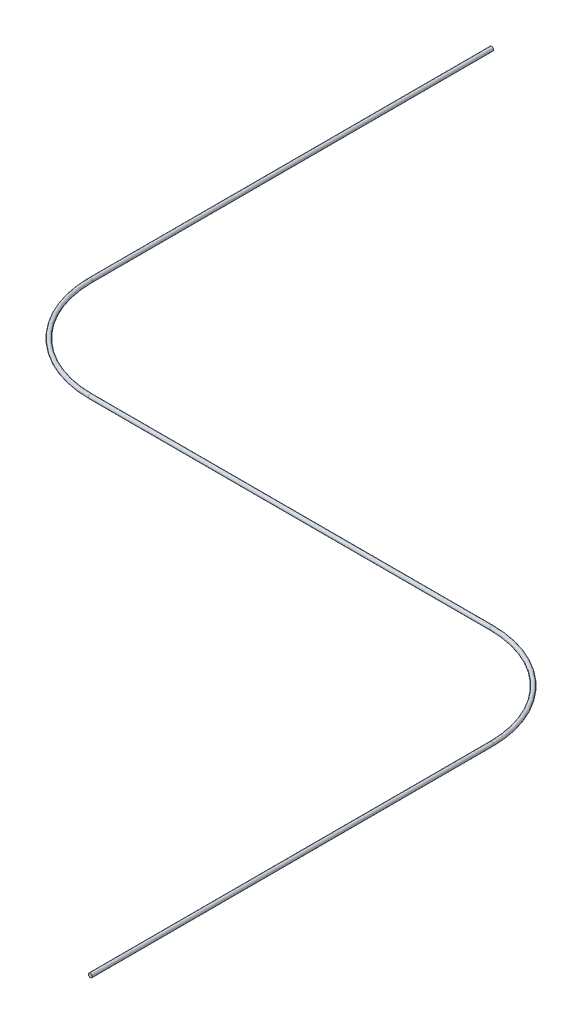
ISO-10303-21;
HEADER;
FILE_DESCRIPTION(('STEP AP214'),'2;1');
FILE_NAME('part.step','',(''),(''),'','','');
FILE_SCHEMA(('AUTOMOTIVE_DESIGN { 1 0 10303 214 1 1 1 1 }'));
ENDSEC;
DATA;
#1=APPLICATION_CONTEXT('core data for automotive mechanical design processes');
#2=APPLICATION_PROTOCOL_DEFINITION('international standard','automotive_design',2000,#1);
#3=PRODUCT_CONTEXT('',#1,'mechanical');
#4=PRODUCT('Part','Part','',(#3));
#5=PRODUCT_RELATED_PRODUCT_CATEGORY('part','',(#4));
#6=PRODUCT_DEFINITION_FORMATION('','',#4);
#7=PRODUCT_DEFINITION_CONTEXT('part definition',#1,'design');
#8=PRODUCT_DEFINITION('design','',#6,#7);
#9=PRODUCT_DEFINITION_SHAPE('','',#8);
#10=(LENGTH_UNIT() NAMED_UNIT(*) SI_UNIT(.MILLI.,.METRE.));
#11=(NAMED_UNIT(*) PLANE_ANGLE_UNIT() SI_UNIT($,.RADIAN.));
#12=(NAMED_UNIT(*) SI_UNIT($,.STERADIAN.) SOLID_ANGLE_UNIT());
#13=UNCERTAINTY_MEASURE_WITH_UNIT(LENGTH_MEASURE(1.E-05),#10,'distance_accuracy_value','');
#14=(GEOMETRIC_REPRESENTATION_CONTEXT(3) GLOBAL_UNCERTAINTY_ASSIGNED_CONTEXT((#13)) GLOBAL_UNIT_ASSIGNED_CONTEXT((#10,
#11,#12)) REPRESENTATION_CONTEXT('',''));
#15=CARTESIAN_POINT('',(0.,0.,0.));
#16=DIRECTION('',(0.,0.,1.));
#17=DIRECTION('',(1.,0.,0.));
#18=AXIS2_PLACEMENT_3D('',#15,#16,#17);
#19=CARTESIAN_POINT('',(0.,0.,0.));
#20=DIRECTION('',(0.,0.,1.));
#21=DIRECTION('',(1.,0.,0.));
#22=AXIS2_PLACEMENT_3D('',#19,#20,#21);
#23=PLANE('',#22);
#24=CARTESIAN_POINT('',(0.,0.,0.));
#25=DIRECTION('',(0.,0.,1.));
#26=DIRECTION('',(1.,0.,0.));
#27=AXIS2_PLACEMENT_3D('',#24,#25,#26);
#28=CIRCLE('',#27,2.);
#29=CARTESIAN_POINT('',(2.,0.,0.));
#30=VERTEX_POINT('',#29);
#31=EDGE_CURVE('E69',#30,#30,#28,.T.);
#32=ORIENTED_EDGE('',*,*,#31,.T.);
#33=EDGE_LOOP('',(#32));
#34=FACE_BOUND('',#33,.T.);
#35=ADVANCED_FACE('F41',(#34),#23,.T.);
#36=CARTESIAN_POINT('',(-600.,0.,-1000.));
#37=DIRECTION('',(0.,0.,1.));
#38=DIRECTION('',(1.,0.,0.));
#39=AXIS2_PLACEMENT_3D('',#36,#37,#38);
#40=PLANE('',#39);
#41=CARTESIAN_POINT('',(-600.,0.,-1000.));
#42=DIRECTION('',(0.,0.,1.));
#43=DIRECTION('',(1.,0.,0.));
#44=AXIS2_PLACEMENT_3D('',#41,#42,#43);
#45=CIRCLE('',#44,2.);
#46=CARTESIAN_POINT('',(-598.,0.,-1000.));
#47=VERTEX_POINT('',#46);
#48=EDGE_CURVE('E10',#47,#47,#45,.T.);
#49=ORIENTED_EDGE('',*,*,#48,.F.);
#50=EDGE_LOOP('',(#49));
#51=FACE_BOUND('',#50,.T.);
#52=ADVANCED_FACE('F77',(#51),#40,.F.);
#53=CARTESIAN_POINT('',(0.,0.,0.));
#54=DIRECTION('',(0.,0.,-1.));
#55=DIRECTION('',(-1.,0.,0.));
#56=AXIS2_PLACEMENT_3D('',#53,#54,#55);
#57=CYLINDRICAL_SURFACE('',#56,2.);
#58=CARTESIAN_POINT('',(0.,0.,-399.999999999999));
#59=DIRECTION('',(0.,0.,1.));
#60=DIRECTION('',(1.,0.,0.));
#61=AXIS2_PLACEMENT_3D('',#58,#59,#60);
#62=CIRCLE('',#61,2.);
#63=CARTESIAN_POINT('',(1.99999999999997,0.,-399.999999999999));
#64=VERTEX_POINT('',#63);
#65=EDGE_CURVE('E65',#64,#64,#62,.T.);
#66=ORIENTED_EDGE('',*,*,#65,.T.);
#67=EDGE_LOOP('',(#66));
#68=FACE_BOUND('',#67,.T.);
#69=ORIENTED_EDGE('',*,*,#31,.F.);
#70=EDGE_LOOP('',(#69));
#71=FACE_BOUND('',#70,.T.);
#72=ADVANCED_FACE('F74',(#68,#71),#57,.T.);
#73=CARTESIAN_POINT('',(-100.,0.,-400.));
#74=DIRECTION('',(0.,1.,0.));
#75=DIRECTION('',(0.,0.,1.));
#76=AXIS2_PLACEMENT_3D('',#73,#74,#75);
#77=TOROIDAL_SURFACE('',#76,100.,2.);
#78=CARTESIAN_POINT('',(-100.000000000001,0.,-500.));
#79=DIRECTION('',(1.,0.,0.));
#80=DIRECTION('',(0.,0.,-1.));
#81=AXIS2_PLACEMENT_3D('',#78,#79,#80);
#82=CIRCLE('',#81,2.);
#83=CARTESIAN_POINT('',(-100.000000000001,0.,-502.));
#84=VERTEX_POINT('',#83);
#85=EDGE_CURVE('E60',#84,#84,#82,.T.);
#86=CARTESIAN_POINT('',(-100.,0.,-400.));
#87=DIRECTION('',(0.,1.,0.));
#88=DIRECTION('',(0.,0.,1.));
#89=AXIS2_PLACEMENT_3D('',#86,#87,#88);
#90=CIRCLE('',#89,102.);
#91=EDGE_CURVE('',#64,#84,#90,.T.);
#92=ORIENTED_EDGE('',*,*,#65,.F.);
#93=ORIENTED_EDGE('',*,*,#85,.T.);
#94=ORIENTED_EDGE('',*,*,#91,.T.);
#95=ORIENTED_EDGE('',*,*,#91,.F.);
#96=EDGE_LOOP('',(#92,#94,#93,#95));
#97=FACE_BOUND('',#96,.T.);
#98=ADVANCED_FACE('F76',(#97),#77,.T.);
#99=CARTESIAN_POINT('',(-100.000000000001,0.,-500.));
#100=DIRECTION('',(-1.,0.,0.));
#101=DIRECTION('',(0.,0.,1.));
#102=AXIS2_PLACEMENT_3D('',#99,#100,#101);
#103=CYLINDRICAL_SURFACE('',#102,2.);
#104=CARTESIAN_POINT('',(-500.,0.,-500.));
#105=DIRECTION('',(1.,0.,0.));
#106=DIRECTION('',(0.,0.,-1.));
#107=AXIS2_PLACEMENT_3D('',#104,#105,#106);
#108=CIRCLE('',#107,2.);
#109=CARTESIAN_POINT('',(-500.,0.,-498.));
#110=VERTEX_POINT('',#109);
#111=EDGE_CURVE('E54',#110,#110,#108,.T.);
#112=ORIENTED_EDGE('',*,*,#111,.T.);
#113=EDGE_LOOP('',(#112));
#114=FACE_BOUND('',#113,.T.);
#115=ORIENTED_EDGE('',*,*,#85,.F.);
#116=EDGE_LOOP('',(#115));
#117=FACE_BOUND('',#116,.T.);
#118=ADVANCED_FACE('F83',(#114,#117),#103,.T.);
#119=CARTESIAN_POINT('',(-500.,0.,-600.));
#120=DIRECTION('',(0.,-1.,0.));
#121=DIRECTION('',(0.,0.,-1.));
#122=AXIS2_PLACEMENT_3D('',#119,#120,#121);
#123=TOROIDAL_SURFACE('',#122,100.,2.);
#124=CARTESIAN_POINT('',(-600.,0.,-600.));
#125=DIRECTION('',(0.,0.,1.));
#126=DIRECTION('',(1.,0.,0.));
#127=AXIS2_PLACEMENT_3D('',#124,#125,#126);
#128=CIRCLE('',#127,2.);
#129=CARTESIAN_POINT('',(-602.,0.,-600.));
#130=VERTEX_POINT('',#129);
#131=EDGE_CURVE('E48',#130,#130,#128,.T.);
#132=CARTESIAN_POINT('',(-500.,0.,-600.));
#133=DIRECTION('',(0.,-1.,0.));
#134=DIRECTION('',(0.,0.,-1.));
#135=AXIS2_PLACEMENT_3D('',#132,#133,#134);
#136=CIRCLE('',#135,102.);
#137=EDGE_CURVE('',#110,#130,#136,.T.);
#138=ORIENTED_EDGE('',*,*,#111,.F.);
#139=ORIENTED_EDGE('',*,*,#131,.T.);
#140=ORIENTED_EDGE('',*,*,#137,.T.);
#141=ORIENTED_EDGE('',*,*,#137,.F.);
#142=EDGE_LOOP('',(#138,#140,#139,#141));
#143=FACE_BOUND('',#142,.T.);
#144=ADVANCED_FACE('F89',(#143),#123,.T.);
#145=CARTESIAN_POINT('',(-600.,0.,-600.));
#146=DIRECTION('',(0.,0.,-1.));
#147=DIRECTION('',(-1.,0.,0.));
#148=AXIS2_PLACEMENT_3D('',#145,#146,#147);
#149=CYLINDRICAL_SURFACE('',#148,2.);
#150=ORIENTED_EDGE('',*,*,#48,.T.);
#151=EDGE_LOOP('',(#150));
#152=FACE_BOUND('',#151,.T.);
#153=ORIENTED_EDGE('',*,*,#131,.F.);
#154=EDGE_LOOP('',(#153));
#155=FACE_BOUND('',#154,.T.);
#156=ADVANCED_FACE('F87',(#152,#155),#149,.T.);
#157=CLOSED_SHELL('',(#35,#52,#72,#98,#118,#144,#156));
#158=MANIFOLD_SOLID_BREP('B2',#157);
#159=ADVANCED_BREP_SHAPE_REPRESENTATION('',(#18,#158),#14);
#160=SHAPE_DEFINITION_REPRESENTATION(#9,#159);
ENDSEC;
END-ISO-10303-21;
